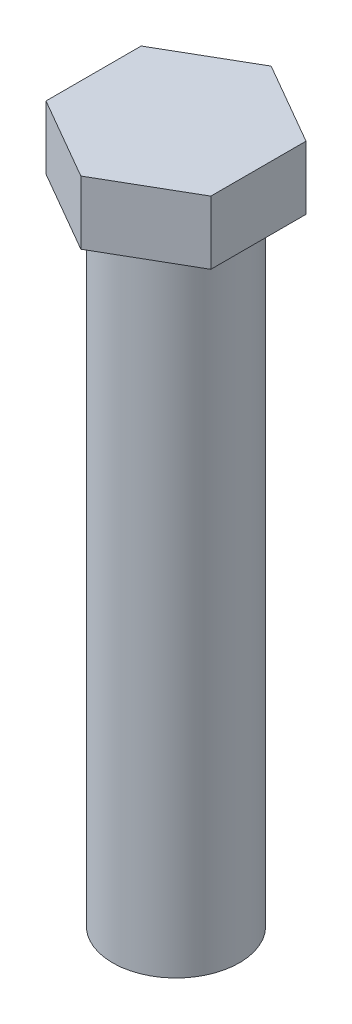
ISO-10303-21;
HEADER;
FILE_DESCRIPTION(('STEP AP214'),'2;1');
FILE_NAME('part.step','',(''),(''),'','','');
FILE_SCHEMA(('AUTOMOTIVE_DESIGN { 1 0 10303 214 1 1 1 1 }'));
ENDSEC;
DATA;
#1=APPLICATION_CONTEXT('core data for automotive mechanical design processes');
#2=APPLICATION_PROTOCOL_DEFINITION('international standard','automotive_design',2000,#1);
#3=PRODUCT_CONTEXT('',#1,'mechanical');
#4=PRODUCT('Part','Part','',(#3));
#5=PRODUCT_RELATED_PRODUCT_CATEGORY('part','',(#4));
#6=PRODUCT_DEFINITION_FORMATION('','',#4);
#7=PRODUCT_DEFINITION_CONTEXT('part definition',#1,'design');
#8=PRODUCT_DEFINITION('design','',#6,#7);
#9=PRODUCT_DEFINITION_SHAPE('','',#8);
#10=(LENGTH_UNIT() NAMED_UNIT(*) SI_UNIT(.MILLI.,.METRE.));
#11=(NAMED_UNIT(*) PLANE_ANGLE_UNIT() SI_UNIT($,.RADIAN.));
#12=(NAMED_UNIT(*) SI_UNIT($,.STERADIAN.) SOLID_ANGLE_UNIT());
#13=UNCERTAINTY_MEASURE_WITH_UNIT(LENGTH_MEASURE(1.E-05),#10,'distance_accuracy_value','');
#14=(GEOMETRIC_REPRESENTATION_CONTEXT(3) GLOBAL_UNCERTAINTY_ASSIGNED_CONTEXT((#13)) GLOBAL_UNIT_ASSIGNED_CONTEXT((#10,
#11,#12)) REPRESENTATION_CONTEXT('',''));
#15=CARTESIAN_POINT('',(0.,0.,0.));
#16=DIRECTION('',(0.,0.,1.));
#17=DIRECTION('',(1.,0.,0.));
#18=AXIS2_PLACEMENT_3D('',#15,#16,#17);
#19=CARTESIAN_POINT('',(0.,59.5238095238097,0.));
#20=DIRECTION('',(0.,1.,0.));
#21=DIRECTION('',(0.,0.,1.));
#22=AXIS2_PLACEMENT_3D('',#19,#20,#21);
#23=CYLINDRICAL_SURFACE('',#22,5.);
#24=CARTESIAN_POINT('',(0.,-25.,0.));
#25=DIRECTION('',(0.,1.,0.));
#26=DIRECTION('',(0.,0.,1.));
#27=AXIS2_PLACEMENT_3D('',#24,#25,#26);
#28=CIRCLE('',#27,5.);
#29=CARTESIAN_POINT('',(0.,-25.,5.));
#30=VERTEX_POINT('',#29);
#31=EDGE_CURVE('E11',#30,#30,#28,.T.);
#32=ORIENTED_EDGE('',*,*,#31,.T.);
#33=EDGE_LOOP('',(#32));
#34=FACE_BOUND('',#33,.T.);
#35=CARTESIAN_POINT('',(0.,25.,0.));
#36=DIRECTION('',(0.,1.,0.));
#37=DIRECTION('',(0.,0.,1.));
#38=AXIS2_PLACEMENT_3D('',#35,#36,#37);
#39=CIRCLE('',#38,5.);
#40=CARTESIAN_POINT('',(0.,25.,5.));
#41=VERTEX_POINT('',#40);
#42=EDGE_CURVE('E40',#41,#41,#39,.T.);
#43=ORIENTED_EDGE('',*,*,#42,.F.);
#44=EDGE_LOOP('',(#43));
#45=FACE_BOUND('',#44,.T.);
#46=ADVANCED_FACE('F32',(#34,#45),#23,.T.);
#47=CARTESIAN_POINT('',(0.,-25.,0.));
#48=DIRECTION('',(0.,-1.,0.));
#49=DIRECTION('',(0.,0.,-1.));
#50=AXIS2_PLACEMENT_3D('',#47,#48,#49);
#51=PLANE('',#50);
#52=ORIENTED_EDGE('',*,*,#31,.F.);
#53=EDGE_LOOP('',(#52));
#54=FACE_BOUND('',#53,.T.);
#55=ADVANCED_FACE('F142',(#54),#51,.T.);
#56=CARTESIAN_POINT('',(0.,30.,-7.50555349946513));
#57=DIRECTION('',(0.5,0.,0.866025403784438));
#58=DIRECTION('',(0.866025403784439,0.,-0.5));
#59=AXIS2_PLACEMENT_3D('',#56,#57,#58);
#60=PLANE('',#59);
#61=DIRECTION('',(-0.866025403784438,0.,0.5));
#62=VECTOR('',#61,1.);
#63=CARTESIAN_POINT('',(0.,25.,-7.50555349946513));
#64=LINE('',#63,#62);
#65=CARTESIAN_POINT('',(0.,25.,-7.50555349946513));
#66=VERTEX_POINT('',#65);
#67=CARTESIAN_POINT('',(-6.5,25.,-3.75277674973256));
#68=VERTEX_POINT('',#67);
#69=EDGE_CURVE('E117',#66,#68,#64,.T.);
#70=ORIENTED_EDGE('',*,*,#69,.T.);
#71=DIRECTION('',(0.,-1.,0.));
#72=VECTOR('',#71,1.);
#73=CARTESIAN_POINT('',(-6.5,30.,-3.75277674973256));
#74=LINE('',#73,#72);
#75=CARTESIAN_POINT('',(-6.5,30.,-3.75277674973256));
#76=VERTEX_POINT('',#75);
#77=EDGE_CURVE('E134',#76,#68,#74,.T.);
#78=ORIENTED_EDGE('',*,*,#77,.F.);
#79=DIRECTION('',(-0.866025403784438,0.,0.5));
#80=VECTOR('',#79,1.);
#81=CARTESIAN_POINT('',(0.,30.,-7.50555349946513));
#82=LINE('',#81,#80);
#83=CARTESIAN_POINT('',(0.,30.,-7.50555349946513));
#84=VERTEX_POINT('',#83);
#85=EDGE_CURVE('E127',#84,#76,#82,.T.);
#86=ORIENTED_EDGE('',*,*,#85,.F.);
#87=DIRECTION('',(0.,-1.,0.));
#88=VECTOR('',#87,1.);
#89=CARTESIAN_POINT('',(0.,30.,-7.50555349946513));
#90=LINE('',#89,#88);
#91=EDGE_CURVE('E113',#84,#66,#90,.T.);
#92=ORIENTED_EDGE('',*,*,#91,.T.);
#93=EDGE_LOOP('',(#70,#78,#86,#92));
#94=FACE_BOUND('',#93,.T.);
#95=ADVANCED_FACE('F147',(#94),#60,.F.);
#96=CARTESIAN_POINT('',(-6.5,30.,-3.75277674973256));
#97=DIRECTION('',(1.,0.,0.));
#98=DIRECTION('',(0.,0.,-1.));
#99=AXIS2_PLACEMENT_3D('',#96,#97,#98);
#100=PLANE('',#99);
#101=DIRECTION('',(0.,0.,1.));
#102=VECTOR('',#101,1.);
#103=CARTESIAN_POINT('',(-6.5,25.,-3.75277674973256));
#104=LINE('',#103,#102);
#105=CARTESIAN_POINT('',(-6.5,25.,3.75277674973257));
#106=VERTEX_POINT('',#105);
#107=EDGE_CURVE('E120',#68,#106,#104,.T.);
#108=ORIENTED_EDGE('',*,*,#107,.T.);
#109=DIRECTION('',(0.,-1.,0.));
#110=VECTOR('',#109,1.);
#111=CARTESIAN_POINT('',(-6.5,30.,3.75277674973257));
#112=LINE('',#111,#110);
#113=CARTESIAN_POINT('',(-6.5,30.,3.75277674973257));
#114=VERTEX_POINT('',#113);
#115=EDGE_CURVE('E131',#114,#106,#112,.T.);
#116=ORIENTED_EDGE('',*,*,#115,.F.);
#117=DIRECTION('',(0.,0.,1.));
#118=VECTOR('',#117,1.);
#119=CARTESIAN_POINT('',(-6.5,30.,-3.75277674973256));
#120=LINE('',#119,#118);
#121=EDGE_CURVE('E86',#76,#114,#120,.T.);
#122=ORIENTED_EDGE('',*,*,#121,.F.);
#123=ORIENTED_EDGE('',*,*,#77,.T.);
#124=EDGE_LOOP('',(#108,#116,#122,#123));
#125=FACE_BOUND('',#124,.T.);
#126=ADVANCED_FACE('F153',(#125),#100,.F.);
#127=CARTESIAN_POINT('',(-6.5,30.,3.75277674973257));
#128=DIRECTION('',(0.5,0.,-0.866025403784438));
#129=DIRECTION('',(-0.866025403784439,0.,-0.5));
#130=AXIS2_PLACEMENT_3D('',#127,#128,#129);
#131=PLANE('',#130);
#132=DIRECTION('',(0.866025403784438,0.,0.5));
#133=VECTOR('',#132,1.);
#134=CARTESIAN_POINT('',(-6.5,25.,3.75277674973257));
#135=LINE('',#134,#133);
#136=CARTESIAN_POINT('',(0.,25.,7.50555349946513));
#137=VERTEX_POINT('',#136);
#138=EDGE_CURVE('E122',#106,#137,#135,.T.);
#139=ORIENTED_EDGE('',*,*,#138,.T.);
#140=DIRECTION('',(0.,-1.,0.));
#141=VECTOR('',#140,1.);
#142=CARTESIAN_POINT('',(0.,30.,7.50555349946513));
#143=LINE('',#142,#141);
#144=CARTESIAN_POINT('',(0.,30.,7.50555349946513));
#145=VERTEX_POINT('',#144);
#146=EDGE_CURVE('E108',#145,#137,#143,.T.);
#147=ORIENTED_EDGE('',*,*,#146,.F.);
#148=DIRECTION('',(0.866025403784438,0.,0.5));
#149=VECTOR('',#148,1.);
#150=CARTESIAN_POINT('',(-6.5,30.,3.75277674973257));
#151=LINE('',#150,#149);
#152=EDGE_CURVE('E99',#114,#145,#151,.T.);
#153=ORIENTED_EDGE('',*,*,#152,.F.);
#154=ORIENTED_EDGE('',*,*,#115,.T.);
#155=EDGE_LOOP('',(#139,#147,#153,#154));
#156=FACE_BOUND('',#155,.T.);
#157=ADVANCED_FACE('F159',(#156),#131,.F.);
#158=CARTESIAN_POINT('',(0.,30.,7.50555349946513));
#159=DIRECTION('',(-0.5,0.,-0.866025403784438));
#160=DIRECTION('',(-0.866025403784439,0.,0.5));
#161=AXIS2_PLACEMENT_3D('',#158,#159,#160);
#162=PLANE('',#161);
#163=DIRECTION('',(0.866025403784439,0.,-0.5));
#164=VECTOR('',#163,1.);
#165=CARTESIAN_POINT('',(0.,25.,7.50555349946513));
#166=LINE('',#165,#164);
#167=CARTESIAN_POINT('',(6.5,25.,3.75277674973256));
#168=VERTEX_POINT('',#167);
#169=EDGE_CURVE('E107',#137,#168,#166,.T.);
#170=ORIENTED_EDGE('',*,*,#169,.T.);
#171=DIRECTION('',(0.,-1.,0.));
#172=VECTOR('',#171,1.);
#173=CARTESIAN_POINT('',(6.5,30.,3.75277674973256));
#174=LINE('',#173,#172);
#175=CARTESIAN_POINT('',(6.5,30.,3.75277674973256));
#176=VERTEX_POINT('',#175);
#177=EDGE_CURVE('E104',#176,#168,#174,.T.);
#178=ORIENTED_EDGE('',*,*,#177,.F.);
#179=DIRECTION('',(0.866025403784439,0.,-0.5));
#180=VECTOR('',#179,1.);
#181=CARTESIAN_POINT('',(0.,30.,7.50555349946513));
#182=LINE('',#181,#180);
#183=EDGE_CURVE('E93',#145,#176,#182,.T.);
#184=ORIENTED_EDGE('',*,*,#183,.F.);
#185=ORIENTED_EDGE('',*,*,#146,.T.);
#186=EDGE_LOOP('',(#170,#178,#184,#185));
#187=FACE_BOUND('',#186,.T.);
#188=ADVANCED_FACE('F105',(#187),#162,.F.);
#189=CARTESIAN_POINT('',(6.5,30.,3.75277674973256));
#190=DIRECTION('',(-1.,0.,0.));
#191=DIRECTION('',(0.,0.,1.));
#192=AXIS2_PLACEMENT_3D('',#189,#190,#191);
#193=PLANE('',#192);
#194=DIRECTION('',(0.,0.,-1.));
#195=VECTOR('',#194,1.);
#196=CARTESIAN_POINT('',(6.5,25.,3.75277674973256));
#197=LINE('',#196,#195);
#198=CARTESIAN_POINT('',(6.5,25.,-3.75277674973257));
#199=VERTEX_POINT('',#198);
#200=EDGE_CURVE('E71',#168,#199,#197,.T.);
#201=ORIENTED_EDGE('',*,*,#200,.T.);
#202=DIRECTION('',(0.,-1.,0.));
#203=VECTOR('',#202,1.);
#204=CARTESIAN_POINT('',(6.5,30.,-3.75277674973257));
#205=LINE('',#204,#203);
#206=CARTESIAN_POINT('',(6.5,30.,-3.75277674973257));
#207=VERTEX_POINT('',#206);
#208=EDGE_CURVE('E109',#207,#199,#205,.T.);
#209=ORIENTED_EDGE('',*,*,#208,.F.);
#210=DIRECTION('',(0.,0.,-1.));
#211=VECTOR('',#210,1.);
#212=CARTESIAN_POINT('',(6.5,30.,3.75277674973256));
#213=LINE('',#212,#211);
#214=EDGE_CURVE('E97',#176,#207,#213,.T.);
#215=ORIENTED_EDGE('',*,*,#214,.F.);
#216=ORIENTED_EDGE('',*,*,#177,.T.);
#217=EDGE_LOOP('',(#201,#209,#215,#216));
#218=FACE_BOUND('',#217,.T.);
#219=ADVANCED_FACE('F111',(#218),#193,.F.);
#220=CARTESIAN_POINT('',(6.5,30.,-3.75277674973257));
#221=DIRECTION('',(-0.5,0.,0.866025403784439));
#222=DIRECTION('',(0.866025403784439,0.,0.5));
#223=AXIS2_PLACEMENT_3D('',#220,#221,#222);
#224=PLANE('',#223);
#225=DIRECTION('',(-0.866025403784438,0.,-0.5));
#226=VECTOR('',#225,1.);
#227=CARTESIAN_POINT('',(6.5,25.,-3.75277674973257));
#228=LINE('',#227,#226);
#229=EDGE_CURVE('E77',#199,#66,#228,.T.);
#230=ORIENTED_EDGE('',*,*,#229,.T.);
#231=ORIENTED_EDGE('',*,*,#91,.F.);
#232=DIRECTION('',(-0.866025403784438,0.,-0.5));
#233=VECTOR('',#232,1.);
#234=CARTESIAN_POINT('',(6.5,30.,-3.75277674973257));
#235=LINE('',#234,#233);
#236=EDGE_CURVE('E48',#207,#84,#235,.T.);
#237=ORIENTED_EDGE('',*,*,#236,.F.);
#238=ORIENTED_EDGE('',*,*,#208,.T.);
#239=EDGE_LOOP('',(#230,#231,#237,#238));
#240=FACE_BOUND('',#239,.T.);
#241=ADVANCED_FACE('F167',(#240),#224,.F.);
#242=CARTESIAN_POINT('',(0.,30.,0.));
#243=DIRECTION('',(0.,1.,0.));
#244=DIRECTION('',(0.,0.,1.));
#245=AXIS2_PLACEMENT_3D('',#242,#243,#244);
#246=PLANE('',#245);
#247=ORIENTED_EDGE('',*,*,#85,.T.);
#248=ORIENTED_EDGE('',*,*,#121,.T.);
#249=ORIENTED_EDGE('',*,*,#152,.T.);
#250=ORIENTED_EDGE('',*,*,#183,.T.);
#251=ORIENTED_EDGE('',*,*,#214,.T.);
#252=ORIENTED_EDGE('',*,*,#236,.T.);
#253=EDGE_LOOP('',(#247,#248,#249,#250,#251,#252));
#254=FACE_BOUND('',#253,.T.);
#255=ADVANCED_FACE('F95',(#254),#246,.T.);
#256=CARTESIAN_POINT('',(0.,25.,0.));
#257=DIRECTION('',(0.,1.,0.));
#258=DIRECTION('',(0.,0.,1.));
#259=AXIS2_PLACEMENT_3D('',#256,#257,#258);
#260=PLANE('',#259);
#261=ORIENTED_EDGE('',*,*,#42,.T.);
#262=EDGE_LOOP('',(#261));
#263=FACE_BOUND('',#262,.T.);
#264=ORIENTED_EDGE('',*,*,#69,.F.);
#265=ORIENTED_EDGE('',*,*,#229,.F.);
#266=ORIENTED_EDGE('',*,*,#200,.F.);
#267=ORIENTED_EDGE('',*,*,#169,.F.);
#268=ORIENTED_EDGE('',*,*,#138,.F.);
#269=ORIENTED_EDGE('',*,*,#107,.F.);
#270=EDGE_LOOP('',(#264,#265,#266,#267,#268,#269));
#271=FACE_BOUND('',#270,.T.);
#272=ADVANCED_FACE('F138',(#263,#271),#260,.F.);
#273=CLOSED_SHELL('',(#46,#55,#95,#126,#157,#188,#219,#241,#255,#272));
#274=MANIFOLD_SOLID_BREP('B2',#273);
#275=ADVANCED_BREP_SHAPE_REPRESENTATION('',(#18,#274),#14);
#276=SHAPE_DEFINITION_REPRESENTATION(#9,#275);
ENDSEC;
END-ISO-10303-21;
